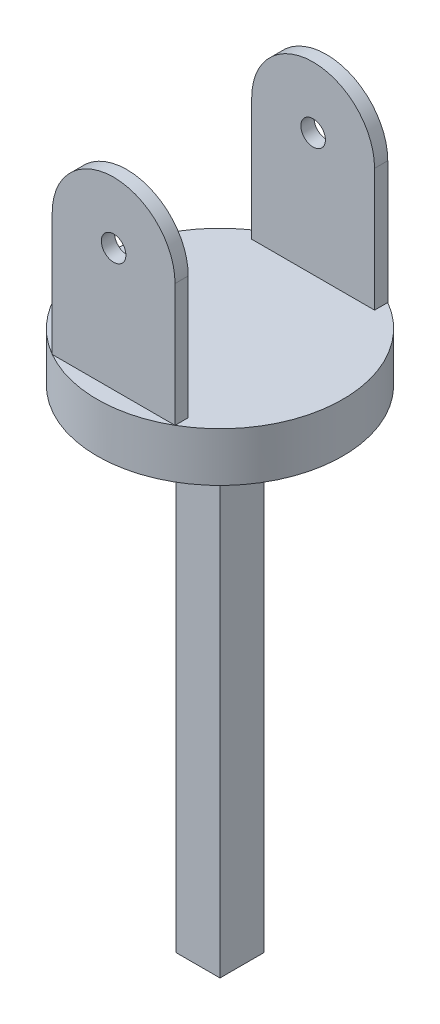
ISO-10303-21;
HEADER;
FILE_DESCRIPTION(('STEP AP214'),'2;1');
FILE_NAME('part.step','',(''),(''),'','','');
FILE_SCHEMA(('AUTOMOTIVE_DESIGN { 1 0 10303 214 1 1 1 1 }'));
ENDSEC;
DATA;
#1=APPLICATION_CONTEXT('core data for automotive mechanical design processes');
#2=APPLICATION_PROTOCOL_DEFINITION('international standard','automotive_design',2000,#1);
#3=PRODUCT_CONTEXT('',#1,'mechanical');
#4=PRODUCT('Part','Part','',(#3));
#5=PRODUCT_RELATED_PRODUCT_CATEGORY('part','',(#4));
#6=PRODUCT_DEFINITION_FORMATION('','',#4);
#7=PRODUCT_DEFINITION_CONTEXT('part definition',#1,'design');
#8=PRODUCT_DEFINITION('design','',#6,#7);
#9=PRODUCT_DEFINITION_SHAPE('','',#8);
#10=(LENGTH_UNIT() NAMED_UNIT(*) SI_UNIT(.MILLI.,.METRE.));
#11=(NAMED_UNIT(*) PLANE_ANGLE_UNIT() SI_UNIT($,.RADIAN.));
#12=(NAMED_UNIT(*) SI_UNIT($,.STERADIAN.) SOLID_ANGLE_UNIT());
#13=UNCERTAINTY_MEASURE_WITH_UNIT(LENGTH_MEASURE(1.E-05),#10,'distance_accuracy_value','');
#14=(GEOMETRIC_REPRESENTATION_CONTEXT(3) GLOBAL_UNCERTAINTY_ASSIGNED_CONTEXT((#13)) GLOBAL_UNIT_ASSIGNED_CONTEXT((#10,
#11,#12)) REPRESENTATION_CONTEXT('',''));
#15=CARTESIAN_POINT('',(0.,0.,0.));
#16=DIRECTION('',(0.,0.,1.));
#17=DIRECTION('',(1.,0.,0.));
#18=AXIS2_PLACEMENT_3D('',#15,#16,#17);
#19=CARTESIAN_POINT('',(0.,54.,-7.58489605585749));
#20=DIRECTION('',(0.,0.,1.));
#21=DIRECTION('',(1.,0.,0.));
#22=AXIS2_PLACEMENT_3D('',#19,#20,#21);
#23=CYLINDRICAL_SURFACE('',#22,5.);
#24=DIRECTION('',(0.,0.,-1.));
#25=VECTOR('',#24,1.);
#26=CARTESIAN_POINT('',(-5.,54.,-7.58489605585749));
#27=LINE('',#26,#25);
#28=CARTESIAN_POINT('',(-5.,54.,-7.58489605585749));
#29=VERTEX_POINT('',#28);
#30=CARTESIAN_POINT('',(-5.,54.,-8.66025403784439));
#31=VERTEX_POINT('',#30);
#32=EDGE_CURVE('E274',#29,#31,#27,.T.);
#33=ORIENTED_EDGE('',*,*,#32,.F.);
#34=CARTESIAN_POINT('',(0.,54.,-7.58489605585749));
#35=DIRECTION('',(0.,0.,-1.));
#36=DIRECTION('',(-1.,0.,0.));
#37=AXIS2_PLACEMENT_3D('',#34,#35,#36);
#38=CIRCLE('',#37,5.);
#39=CARTESIAN_POINT('',(5.,54.,-7.58489605585749));
#40=VERTEX_POINT('',#39);
#41=EDGE_CURVE('E56',#40,#29,#38,.F.);
#42=ORIENTED_EDGE('',*,*,#41,.F.);
#43=DIRECTION('',(0.,0.,-1.));
#44=VECTOR('',#43,1.);
#45=CARTESIAN_POINT('',(5.,54.,-7.58489605585749));
#46=LINE('',#45,#44);
#47=CARTESIAN_POINT('',(5.,54.,-8.66025403784439));
#48=VERTEX_POINT('',#47);
#49=EDGE_CURVE('E139',#48,#40,#46,.F.);
#50=ORIENTED_EDGE('',*,*,#49,.F.);
#51=CARTESIAN_POINT('',(0.,54.,-8.66025403784439));
#52=DIRECTION('',(0.,0.,1.));
#53=DIRECTION('',(1.,0.,0.));
#54=AXIS2_PLACEMENT_3D('',#51,#52,#53);
#55=CIRCLE('',#54,5.);
#56=EDGE_CURVE('E11',#31,#48,#55,.F.);
#57=ORIENTED_EDGE('',*,*,#56,.F.);
#58=EDGE_LOOP('',(#33,#42,#50,#57));
#59=FACE_BOUND('',#58,.T.);
#60=ADVANCED_FACE('F47',(#59),#23,.T.);
#61=CARTESIAN_POINT('',(0.,54.,8.66025403784439));
#62=DIRECTION('',(0.,0.,1.));
#63=DIRECTION('',(1.,0.,0.));
#64=AXIS2_PLACEMENT_3D('',#61,#62,#63);
#65=CYLINDRICAL_SURFACE('',#64,5.);
#66=DIRECTION('',(0.,0.,-1.));
#67=VECTOR('',#66,1.);
#68=CARTESIAN_POINT('',(-5.,54.,8.66025403784439));
#69=LINE('',#68,#67);
#70=CARTESIAN_POINT('',(-5.,54.,8.66025403784439));
#71=VERTEX_POINT('',#70);
#72=CARTESIAN_POINT('',(-5.,54.,7.58489605585749));
#73=VERTEX_POINT('',#72);
#74=EDGE_CURVE('E260',#71,#73,#69,.T.);
#75=ORIENTED_EDGE('',*,*,#74,.F.);
#76=CARTESIAN_POINT('',(0.,54.,8.66025403784439));
#77=DIRECTION('',(0.,0.,-1.));
#78=DIRECTION('',(-1.,0.,0.));
#79=AXIS2_PLACEMENT_3D('',#76,#77,#78);
#80=CIRCLE('',#79,5.);
#81=CARTESIAN_POINT('',(5.,54.,8.66025403784439));
#82=VERTEX_POINT('',#81);
#83=EDGE_CURVE('E268',#82,#71,#80,.F.);
#84=ORIENTED_EDGE('',*,*,#83,.F.);
#85=DIRECTION('',(0.,0.,-1.));
#86=VECTOR('',#85,1.);
#87=CARTESIAN_POINT('',(5.,54.,8.66025403784439));
#88=LINE('',#87,#86);
#89=CARTESIAN_POINT('',(5.,54.,7.58489605585749));
#90=VERTEX_POINT('',#89);
#91=EDGE_CURVE('E264',#90,#82,#88,.F.);
#92=ORIENTED_EDGE('',*,*,#91,.F.);
#93=CARTESIAN_POINT('',(0.,54.,7.58489605585749));
#94=DIRECTION('',(0.,0.,1.));
#95=DIRECTION('',(1.,0.,0.));
#96=AXIS2_PLACEMENT_3D('',#93,#94,#95);
#97=CIRCLE('',#96,5.);
#98=EDGE_CURVE('E271',#73,#90,#97,.F.);
#99=ORIENTED_EDGE('',*,*,#98,.F.);
#100=EDGE_LOOP('',(#75,#84,#92,#99));
#101=FACE_BOUND('',#100,.T.);
#102=ADVANCED_FACE('F314',(#101),#65,.T.);
#103=CARTESIAN_POINT('',(0.,44.,0.));
#104=DIRECTION('',(0.,1.,0.));
#105=DIRECTION('',(0.,0.,1.));
#106=AXIS2_PLACEMENT_3D('',#103,#104,#105);
#107=PLANE('',#106);
#108=DIRECTION('',(0.,0.,1.));
#109=VECTOR('',#108,1.);
#110=CARTESIAN_POINT('',(-5.,44.,-8.66025403784439));
#111=LINE('',#110,#109);
#112=CARTESIAN_POINT('',(-5.,44.,-8.66025403784439));
#113=VERTEX_POINT('',#112);
#114=CARTESIAN_POINT('',(-5.,44.,-7.58489605585749));
#115=VERTEX_POINT('',#114);
#116=EDGE_CURVE('E162',#113,#115,#111,.T.);
#117=ORIENTED_EDGE('',*,*,#116,.F.);
#118=CARTESIAN_POINT('',(0.,44.,0.));
#119=DIRECTION('',(0.,1.,0.));
#120=DIRECTION('',(0.,0.,1.));
#121=AXIS2_PLACEMENT_3D('',#118,#119,#120);
#122=CIRCLE('',#121,10.);
#123=CARTESIAN_POINT('',(-5.,44.,8.66025403784439));
#124=VERTEX_POINT('',#123);
#125=EDGE_CURVE('E285',#113,#124,#122,.T.);
#126=ORIENTED_EDGE('',*,*,#125,.T.);
#127=DIRECTION('',(0.,0.,1.));
#128=VECTOR('',#127,1.);
#129=CARTESIAN_POINT('',(-5.,44.,8.66025403784439));
#130=LINE('',#129,#128);
#131=CARTESIAN_POINT('',(-5.,44.,7.58489605585749));
#132=VERTEX_POINT('',#131);
#133=EDGE_CURVE('E193',#132,#124,#130,.T.);
#134=ORIENTED_EDGE('',*,*,#133,.F.);
#135=DIRECTION('',(-1.,0.,0.));
#136=VECTOR('',#135,1.);
#137=CARTESIAN_POINT('',(-5.,44.,7.58489605585749));
#138=LINE('',#137,#136);
#139=CARTESIAN_POINT('',(5.,44.,7.58489605585749));
#140=VERTEX_POINT('',#139);
#141=EDGE_CURVE('E197',#140,#132,#138,.T.);
#142=ORIENTED_EDGE('',*,*,#141,.F.);
#143=DIRECTION('',(0.,0.,-1.));
#144=VECTOR('',#143,1.);
#145=CARTESIAN_POINT('',(5.,44.,8.66025403784439));
#146=LINE('',#145,#144);
#147=CARTESIAN_POINT('',(5.,44.,8.66025403784439));
#148=VERTEX_POINT('',#147);
#149=EDGE_CURVE('E201',#148,#140,#146,.T.);
#150=ORIENTED_EDGE('',*,*,#149,.F.);
#151=CARTESIAN_POINT('',(5.,44.,-8.66025403784439));
#152=VERTEX_POINT('',#151);
#153=EDGE_CURVE('E155',#148,#152,#122,.T.);
#154=ORIENTED_EDGE('',*,*,#153,.T.);
#155=DIRECTION('',(0.,0.,-1.));
#156=VECTOR('',#155,1.);
#157=CARTESIAN_POINT('',(5.,44.,-8.66025403784439));
#158=LINE('',#157,#156);
#159=CARTESIAN_POINT('',(5.,44.,-7.58489605585749));
#160=VERTEX_POINT('',#159);
#161=EDGE_CURVE('E138',#160,#152,#158,.T.);
#162=ORIENTED_EDGE('',*,*,#161,.F.);
#163=DIRECTION('',(1.,0.,0.));
#164=VECTOR('',#163,1.);
#165=CARTESIAN_POINT('',(-5.,44.,-7.58489605585749));
#166=LINE('',#165,#164);
#167=EDGE_CURVE('E151',#115,#160,#166,.T.);
#168=ORIENTED_EDGE('',*,*,#167,.F.);
#169=EDGE_LOOP('',(#117,#126,#134,#142,#150,#154,#162,#168));
#170=FACE_BOUND('',#169,.T.);
#171=ADVANCED_FACE('F150',(#170),#107,.T.);
#172=DIRECTION('',(1.,0.,0.));
#173=VECTOR('',#172,1.);
#174=CARTESIAN_POINT('',(-5.,44.,8.66025403784439));
#175=LINE('',#174,#173);
#176=EDGE_CURVE('E165',#124,#148,#175,.T.);
#177=ORIENTED_EDGE('',*,*,#176,.F.);
#178=EDGE_CURVE('E212',#124,#148,#122,.T.);
#179=ORIENTED_EDGE('',*,*,#178,.T.);
#180=EDGE_LOOP('',(#177,#179));
#181=FACE_BOUND('',#180,.T.);
#182=ADVANCED_FACE('F326',(#181),#107,.T.);
#183=CARTESIAN_POINT('',(1.8,40.,1.8));
#184=DIRECTION('',(-1.,0.,0.));
#185=DIRECTION('',(0.,0.,1.));
#186=AXIS2_PLACEMENT_3D('',#183,#184,#185);
#187=PLANE('',#186);
#188=DIRECTION('',(0.,0.,-1.));
#189=VECTOR('',#188,1.);
#190=CARTESIAN_POINT('',(1.8,0.,1.8));
#191=LINE('',#190,#189);
#192=CARTESIAN_POINT('',(1.8,0.,1.8));
#193=VERTEX_POINT('',#192);
#194=CARTESIAN_POINT('',(1.8,0.,-1.8));
#195=VERTEX_POINT('',#194);
#196=EDGE_CURVE('E210',#193,#195,#191,.T.);
#197=ORIENTED_EDGE('',*,*,#196,.T.);
#198=DIRECTION('',(0.,-1.,0.));
#199=VECTOR('',#198,1.);
#200=CARTESIAN_POINT('',(1.8,40.,-1.8));
#201=LINE('',#200,#199);
#202=CARTESIAN_POINT('',(1.8,40.,-1.8));
#203=VERTEX_POINT('',#202);
#204=EDGE_CURVE('E256',#203,#195,#201,.T.);
#205=ORIENTED_EDGE('',*,*,#204,.F.);
#206=DIRECTION('',(0.,0.,-1.));
#207=VECTOR('',#206,1.);
#208=CARTESIAN_POINT('',(1.8,40.,1.8));
#209=LINE('',#208,#207);
#210=CARTESIAN_POINT('',(1.8,40.,1.8));
#211=VERTEX_POINT('',#210);
#212=EDGE_CURVE('E216',#211,#203,#209,.T.);
#213=ORIENTED_EDGE('',*,*,#212,.F.);
#214=DIRECTION('',(0.,-1.,0.));
#215=VECTOR('',#214,1.);
#216=CARTESIAN_POINT('',(1.8,40.,1.8));
#217=LINE('',#216,#215);
#218=EDGE_CURVE('E233',#211,#193,#217,.T.);
#219=ORIENTED_EDGE('',*,*,#218,.T.);
#220=EDGE_LOOP('',(#197,#205,#213,#219));
#221=FACE_BOUND('',#220,.T.);
#222=ADVANCED_FACE('F333',(#221),#187,.F.);
#223=CARTESIAN_POINT('',(-1.8,40.,-1.8));
#224=DIRECTION('',(0.,0.,1.));
#225=DIRECTION('',(1.,0.,0.));
#226=AXIS2_PLACEMENT_3D('',#223,#224,#225);
#227=PLANE('',#226);
#228=DIRECTION('',(-1.,0.,0.));
#229=VECTOR('',#228,1.);
#230=CARTESIAN_POINT('',(-1.8,0.,-1.8));
#231=LINE('',#230,#229);
#232=CARTESIAN_POINT('',(-1.8,0.,-1.8));
#233=VERTEX_POINT('',#232);
#234=EDGE_CURVE('E237',#195,#233,#231,.T.);
#235=ORIENTED_EDGE('',*,*,#234,.T.);
#236=DIRECTION('',(0.,-1.,0.));
#237=VECTOR('',#236,1.);
#238=CARTESIAN_POINT('',(-1.8,40.,-1.8));
#239=LINE('',#238,#237);
#240=CARTESIAN_POINT('',(-1.8,40.,-1.8));
#241=VERTEX_POINT('',#240);
#242=EDGE_CURVE('E252',#241,#233,#239,.T.);
#243=ORIENTED_EDGE('',*,*,#242,.F.);
#244=DIRECTION('',(-1.,0.,0.));
#245=VECTOR('',#244,1.);
#246=CARTESIAN_POINT('',(-1.8,40.,-1.8));
#247=LINE('',#246,#245);
#248=EDGE_CURVE('E220',#203,#241,#247,.T.);
#249=ORIENTED_EDGE('',*,*,#248,.F.);
#250=ORIENTED_EDGE('',*,*,#204,.T.);
#251=EDGE_LOOP('',(#235,#243,#249,#250));
#252=FACE_BOUND('',#251,.T.);
#253=ADVANCED_FACE('F336',(#252),#227,.F.);
#254=CARTESIAN_POINT('',(-1.8,40.,1.8));
#255=DIRECTION('',(1.,0.,0.));
#256=DIRECTION('',(0.,0.,-1.));
#257=AXIS2_PLACEMENT_3D('',#254,#255,#256);
#258=PLANE('',#257);
#259=DIRECTION('',(0.,0.,1.));
#260=VECTOR('',#259,1.);
#261=CARTESIAN_POINT('',(-1.8,0.,1.8));
#262=LINE('',#261,#260);
#263=CARTESIAN_POINT('',(-1.8,0.,1.8));
#264=VERTEX_POINT('',#263);
#265=EDGE_CURVE('E240',#233,#264,#262,.T.);
#266=ORIENTED_EDGE('',*,*,#265,.T.);
#267=DIRECTION('',(0.,-1.,0.));
#268=VECTOR('',#267,1.);
#269=CARTESIAN_POINT('',(-1.8,40.,1.8));
#270=LINE('',#269,#268);
#271=CARTESIAN_POINT('',(-1.8,40.,1.8));
#272=VERTEX_POINT('',#271);
#273=EDGE_CURVE('E248',#272,#264,#270,.T.);
#274=ORIENTED_EDGE('',*,*,#273,.F.);
#275=DIRECTION('',(0.,0.,1.));
#276=VECTOR('',#275,1.);
#277=CARTESIAN_POINT('',(-1.8,40.,1.8));
#278=LINE('',#277,#276);
#279=EDGE_CURVE('E225',#241,#272,#278,.T.);
#280=ORIENTED_EDGE('',*,*,#279,.F.);
#281=ORIENTED_EDGE('',*,*,#242,.T.);
#282=EDGE_LOOP('',(#266,#274,#280,#281));
#283=FACE_BOUND('',#282,.T.);
#284=ADVANCED_FACE('F340',(#283),#258,.F.);
#285=CARTESIAN_POINT('',(-1.8,40.,1.8));
#286=DIRECTION('',(0.,0.,-1.));
#287=DIRECTION('',(-1.,0.,0.));
#288=AXIS2_PLACEMENT_3D('',#285,#286,#287);
#289=PLANE('',#288);
#290=DIRECTION('',(1.,0.,0.));
#291=VECTOR('',#290,1.);
#292=CARTESIAN_POINT('',(-1.8,0.,1.8));
#293=LINE('',#292,#291);
#294=EDGE_CURVE('E221',#264,#193,#293,.T.);
#295=ORIENTED_EDGE('',*,*,#294,.T.);
#296=ORIENTED_EDGE('',*,*,#218,.F.);
#297=DIRECTION('',(1.,0.,0.));
#298=VECTOR('',#297,1.);
#299=CARTESIAN_POINT('',(-1.8,40.,1.8));
#300=LINE('',#299,#298);
#301=EDGE_CURVE('E229',#272,#211,#300,.T.);
#302=ORIENTED_EDGE('',*,*,#301,.F.);
#303=ORIENTED_EDGE('',*,*,#273,.T.);
#304=EDGE_LOOP('',(#295,#296,#302,#303));
#305=FACE_BOUND('',#304,.T.);
#306=ADVANCED_FACE('F344',(#305),#289,.F.);
#307=CARTESIAN_POINT('',(0.,0.,0.));
#308=DIRECTION('',(0.,-1.,0.));
#309=DIRECTION('',(0.,0.,-1.));
#310=AXIS2_PLACEMENT_3D('',#307,#308,#309);
#311=PLANE('',#310);
#312=ORIENTED_EDGE('',*,*,#196,.F.);
#313=ORIENTED_EDGE('',*,*,#294,.F.);
#314=ORIENTED_EDGE('',*,*,#265,.F.);
#315=ORIENTED_EDGE('',*,*,#234,.F.);
#316=EDGE_LOOP('',(#312,#313,#314,#315));
#317=FACE_BOUND('',#316,.T.);
#318=ADVANCED_FACE('F348',(#317),#311,.T.);
#319=CARTESIAN_POINT('',(0.,40.,0.));
#320=DIRECTION('',(0.,1.,0.));
#321=DIRECTION('',(0.,0.,1.));
#322=AXIS2_PLACEMENT_3D('',#319,#320,#321);
#323=PLANE('',#322);
#324=CARTESIAN_POINT('',(0.,40.,0.));
#325=DIRECTION('',(0.,1.,0.));
#326=DIRECTION('',(0.,0.,1.));
#327=AXIS2_PLACEMENT_3D('',#324,#325,#326);
#328=CIRCLE('',#327,10.);
#329=CARTESIAN_POINT('',(0.,40.,10.));
#330=VERTEX_POINT('',#329);
#331=EDGE_CURVE('E179',#330,#330,#328,.T.);
#332=ORIENTED_EDGE('',*,*,#331,.F.);
#333=EDGE_LOOP('',(#332));
#334=FACE_BOUND('',#333,.T.);
#335=ORIENTED_EDGE('',*,*,#301,.T.);
#336=ORIENTED_EDGE('',*,*,#212,.T.);
#337=ORIENTED_EDGE('',*,*,#248,.T.);
#338=ORIENTED_EDGE('',*,*,#279,.T.);
#339=EDGE_LOOP('',(#335,#336,#337,#338));
#340=FACE_BOUND('',#339,.T.);
#341=ADVANCED_FACE('F352',(#334,#340),#323,.F.);
#342=CARTESIAN_POINT('',(0.,44.,0.));
#343=DIRECTION('',(0.,-1.,0.));
#344=DIRECTION('',(0.,0.,-1.));
#345=AXIS2_PLACEMENT_3D('',#342,#343,#344);
#346=CYLINDRICAL_SURFACE('',#345,10.);
#347=ORIENTED_EDGE('',*,*,#153,.F.);
#348=ORIENTED_EDGE('',*,*,#178,.F.);
#349=ORIENTED_EDGE('',*,*,#125,.F.);
#350=EDGE_CURVE('E211',#152,#113,#122,.T.);
#351=ORIENTED_EDGE('',*,*,#350,.F.);
#352=EDGE_LOOP('',(#347,#348,#349,#351));
#353=FACE_BOUND('',#352,.T.);
#354=ORIENTED_EDGE('',*,*,#331,.T.);
#355=EDGE_LOOP('',(#354));
#356=FACE_BOUND('',#355,.T.);
#357=ADVANCED_FACE('F290',(#353,#356),#346,.T.);
#358=DIRECTION('',(-1.,0.,0.));
#359=VECTOR('',#358,1.);
#360=CARTESIAN_POINT('',(-5.,44.,-8.66025403784439));
#361=LINE('',#360,#359);
#362=EDGE_CURVE('E157',#152,#113,#361,.T.);
#363=ORIENTED_EDGE('',*,*,#362,.F.);
#364=ORIENTED_EDGE('',*,*,#350,.T.);
#365=EDGE_LOOP('',(#363,#364));
#366=FACE_BOUND('',#365,.T.);
#367=ADVANCED_FACE('F296',(#366),#107,.T.);
#368=CARTESIAN_POINT('',(-5.,59.,8.66025403784439));
#369=DIRECTION('',(0.,0.,-1.));
#370=DIRECTION('',(-1.,0.,0.));
#371=AXIS2_PLACEMENT_3D('',#368,#369,#370);
#372=PLANE('',#371);
#373=CARTESIAN_POINT('',(0.,54.,8.66025403784439));
#374=DIRECTION('',(0.,0.,1.));
#375=DIRECTION('',(1.,0.,0.));
#376=AXIS2_PLACEMENT_3D('',#373,#374,#375);
#377=CIRCLE('',#376,1.);
#378=CARTESIAN_POINT('',(1.,54.,8.66025403784439));
#379=VERTEX_POINT('',#378);
#380=EDGE_CURVE('E388',#379,#379,#377,.T.);
#381=ORIENTED_EDGE('',*,*,#380,.F.);
#382=EDGE_LOOP('',(#381));
#383=FACE_BOUND('',#382,.T.);
#384=DIRECTION('',(0.,-1.,0.));
#385=VECTOR('',#384,1.);
#386=CARTESIAN_POINT('',(5.,59.,8.66025403784439));
#387=LINE('',#386,#385);
#388=EDGE_CURVE('E180',#82,#148,#387,.T.);
#389=ORIENTED_EDGE('',*,*,#388,.F.);
#390=ORIENTED_EDGE('',*,*,#83,.T.);
#391=DIRECTION('',(0.,-1.,0.));
#392=VECTOR('',#391,1.);
#393=CARTESIAN_POINT('',(-5.,59.,8.66025403784439));
#394=LINE('',#393,#392);
#395=EDGE_CURVE('E190',#71,#124,#394,.T.);
#396=ORIENTED_EDGE('',*,*,#395,.T.);
#397=ORIENTED_EDGE('',*,*,#176,.T.);
#398=EDGE_LOOP('',(#389,#390,#396,#397));
#399=FACE_BOUND('',#398,.T.);
#400=ADVANCED_FACE('F359',(#383,#399),#372,.F.);
#401=CARTESIAN_POINT('',(5.,59.,8.66025403784439));
#402=DIRECTION('',(-1.,0.,0.));
#403=DIRECTION('',(0.,0.,1.));
#404=AXIS2_PLACEMENT_3D('',#401,#402,#403);
#405=PLANE('',#404);
#406=DIRECTION('',(0.,-1.,0.));
#407=VECTOR('',#406,1.);
#408=CARTESIAN_POINT('',(5.,59.,7.58489605585749));
#409=LINE('',#408,#407);
#410=EDGE_CURVE('E183',#90,#140,#409,.T.);
#411=ORIENTED_EDGE('',*,*,#410,.F.);
#412=ORIENTED_EDGE('',*,*,#91,.T.);
#413=ORIENTED_EDGE('',*,*,#388,.T.);
#414=ORIENTED_EDGE('',*,*,#149,.T.);
#415=EDGE_LOOP('',(#411,#412,#413,#414));
#416=FACE_BOUND('',#415,.T.);
#417=ADVANCED_FACE('F366',(#416),#405,.F.);
#418=CARTESIAN_POINT('',(-5.,59.,7.58489605585749));
#419=DIRECTION('',(0.,0.,1.));
#420=DIRECTION('',(1.,0.,0.));
#421=AXIS2_PLACEMENT_3D('',#418,#419,#420);
#422=PLANE('',#421);
#423=CARTESIAN_POINT('',(0.,54.,7.58489605585749));
#424=DIRECTION('',(0.,0.,1.));
#425=DIRECTION('',(1.,0.,0.));
#426=AXIS2_PLACEMENT_3D('',#423,#424,#425);
#427=CIRCLE('',#426,1.);
#428=CARTESIAN_POINT('',(1.,54.,7.58489605585749));
#429=VERTEX_POINT('',#428);
#430=EDGE_CURVE('E184',#429,#429,#427,.T.);
#431=ORIENTED_EDGE('',*,*,#430,.T.);
#432=EDGE_LOOP('',(#431));
#433=FACE_BOUND('',#432,.T.);
#434=DIRECTION('',(0.,-1.,0.));
#435=VECTOR('',#434,1.);
#436=CARTESIAN_POINT('',(-5.,59.,7.58489605585749));
#437=LINE('',#436,#435);
#438=EDGE_CURVE('E187',#73,#132,#437,.T.);
#439=ORIENTED_EDGE('',*,*,#438,.F.);
#440=ORIENTED_EDGE('',*,*,#98,.T.);
#441=ORIENTED_EDGE('',*,*,#410,.T.);
#442=ORIENTED_EDGE('',*,*,#141,.T.);
#443=EDGE_LOOP('',(#439,#440,#441,#442));
#444=FACE_BOUND('',#443,.T.);
#445=ADVANCED_FACE('F362',(#433,#444),#422,.F.);
#446=CARTESIAN_POINT('',(-5.,59.,8.66025403784439));
#447=DIRECTION('',(1.,0.,0.));
#448=DIRECTION('',(0.,0.,-1.));
#449=AXIS2_PLACEMENT_3D('',#446,#447,#448);
#450=PLANE('',#449);
#451=ORIENTED_EDGE('',*,*,#395,.F.);
#452=ORIENTED_EDGE('',*,*,#74,.T.);
#453=ORIENTED_EDGE('',*,*,#438,.T.);
#454=ORIENTED_EDGE('',*,*,#133,.T.);
#455=EDGE_LOOP('',(#451,#452,#453,#454));
#456=FACE_BOUND('',#455,.T.);
#457=ADVANCED_FACE('F360',(#456),#450,.F.);
#458=CARTESIAN_POINT('',(-5.,59.,-8.66025403784439));
#459=DIRECTION('',(1.,0.,0.));
#460=DIRECTION('',(0.,0.,-1.));
#461=AXIS2_PLACEMENT_3D('',#458,#459,#460);
#462=PLANE('',#461);
#463=DIRECTION('',(0.,-1.,0.));
#464=VECTOR('',#463,1.);
#465=CARTESIAN_POINT('',(-5.,59.,-7.58489605585749));
#466=LINE('',#465,#464);
#467=EDGE_CURVE('E143',#29,#115,#466,.T.);
#468=ORIENTED_EDGE('',*,*,#467,.F.);
#469=ORIENTED_EDGE('',*,*,#32,.T.);
#470=DIRECTION('',(0.,-1.,0.));
#471=VECTOR('',#470,1.);
#472=CARTESIAN_POINT('',(-5.,59.,-8.66025403784439));
#473=LINE('',#472,#471);
#474=EDGE_CURVE('E172',#31,#113,#473,.T.);
#475=ORIENTED_EDGE('',*,*,#474,.T.);
#476=ORIENTED_EDGE('',*,*,#116,.T.);
#477=EDGE_LOOP('',(#468,#469,#475,#476));
#478=FACE_BOUND('',#477,.T.);
#479=ADVANCED_FACE('F281',(#478),#462,.F.);
#480=CARTESIAN_POINT('',(-5.,59.,-7.58489605585749));
#481=DIRECTION('',(0.,0.,-1.));
#482=DIRECTION('',(-1.,0.,0.));
#483=AXIS2_PLACEMENT_3D('',#480,#481,#482);
#484=PLANE('',#483);
#485=CARTESIAN_POINT('',(0.,54.,-7.58489605585749));
#486=DIRECTION('',(0.,0.,-1.));
#487=DIRECTION('',(-1.,0.,0.));
#488=AXIS2_PLACEMENT_3D('',#485,#486,#487);
#489=CIRCLE('',#488,1.);
#490=CARTESIAN_POINT('',(-1.,54.,-7.58489605585749));
#491=VERTEX_POINT('',#490);
#492=EDGE_CURVE('E379',#491,#491,#489,.T.);
#493=ORIENTED_EDGE('',*,*,#492,.T.);
#494=EDGE_LOOP('',(#493));
#495=FACE_BOUND('',#494,.T.);
#496=DIRECTION('',(0.,-1.,0.));
#497=VECTOR('',#496,1.);
#498=CARTESIAN_POINT('',(5.,59.,-7.58489605585749));
#499=LINE('',#498,#497);
#500=EDGE_CURVE('E134',#40,#160,#499,.T.);
#501=ORIENTED_EDGE('',*,*,#500,.F.);
#502=ORIENTED_EDGE('',*,*,#41,.T.);
#503=ORIENTED_EDGE('',*,*,#467,.T.);
#504=ORIENTED_EDGE('',*,*,#167,.T.);
#505=EDGE_LOOP('',(#501,#502,#503,#504));
#506=FACE_BOUND('',#505,.T.);
#507=ADVANCED_FACE('F159',(#495,#506),#484,.F.);
#508=CARTESIAN_POINT('',(5.,59.,-8.66025403784439));
#509=DIRECTION('',(-1.,0.,0.));
#510=DIRECTION('',(0.,0.,1.));
#511=AXIS2_PLACEMENT_3D('',#508,#509,#510);
#512=PLANE('',#511);
#513=DIRECTION('',(0.,-1.,0.));
#514=VECTOR('',#513,1.);
#515=CARTESIAN_POINT('',(5.,59.,-8.66025403784439));
#516=LINE('',#515,#514);
#517=EDGE_CURVE('E144',#48,#152,#516,.T.);
#518=ORIENTED_EDGE('',*,*,#517,.F.);
#519=ORIENTED_EDGE('',*,*,#49,.T.);
#520=ORIENTED_EDGE('',*,*,#500,.T.);
#521=ORIENTED_EDGE('',*,*,#161,.T.);
#522=EDGE_LOOP('',(#518,#519,#520,#521));
#523=FACE_BOUND('',#522,.T.);
#524=ADVANCED_FACE('F137',(#523),#512,.F.);
#525=CARTESIAN_POINT('',(-5.,59.,-8.66025403784439));
#526=DIRECTION('',(0.,0.,1.));
#527=DIRECTION('',(1.,0.,0.));
#528=AXIS2_PLACEMENT_3D('',#525,#526,#527);
#529=PLANE('',#528);
#530=CARTESIAN_POINT('',(0.,54.,-8.66025403784439));
#531=DIRECTION('',(0.,0.,1.));
#532=DIRECTION('',(1.,0.,0.));
#533=AXIS2_PLACEMENT_3D('',#530,#531,#532);
#534=CIRCLE('',#533,1.);
#535=CARTESIAN_POINT('',(1.,54.,-8.66025403784439));
#536=VERTEX_POINT('',#535);
#537=EDGE_CURVE('E382',#536,#536,#534,.F.);
#538=ORIENTED_EDGE('',*,*,#537,.F.);
#539=EDGE_LOOP('',(#538));
#540=FACE_BOUND('',#539,.T.);
#541=ORIENTED_EDGE('',*,*,#474,.F.);
#542=ORIENTED_EDGE('',*,*,#56,.T.);
#543=ORIENTED_EDGE('',*,*,#517,.T.);
#544=ORIENTED_EDGE('',*,*,#362,.T.);
#545=EDGE_LOOP('',(#541,#542,#543,#544));
#546=FACE_BOUND('',#545,.T.);
#547=ADVANCED_FACE('F298',(#540,#546),#529,.F.);
#548=CARTESIAN_POINT('',(0.,54.,-11.4886811625906));
#549=DIRECTION('',(0.,0.,1.));
#550=DIRECTION('',(1.,0.,0.));
#551=AXIS2_PLACEMENT_3D('',#548,#549,#550);
#552=CYLINDRICAL_SURFACE('',#551,1.);
#553=ORIENTED_EDGE('',*,*,#537,.T.);
#554=EDGE_LOOP('',(#553));
#555=FACE_BOUND('',#554,.T.);
#556=ORIENTED_EDGE('',*,*,#492,.F.);
#557=EDGE_LOOP('',(#556));
#558=FACE_BOUND('',#557,.T.);
#559=ADVANCED_FACE('F300',(#555,#558),#552,.F.);
#560=ORIENTED_EDGE('',*,*,#380,.T.);
#561=EDGE_LOOP('',(#560));
#562=FACE_BOUND('',#561,.T.);
#563=ORIENTED_EDGE('',*,*,#430,.F.);
#564=EDGE_LOOP('',(#563));
#565=FACE_BOUND('',#564,.T.);
#566=ADVANCED_FACE('F307',(#562,#565),#552,.F.);
#567=CLOSED_SHELL('',(#60,#102,#171,#182,#222,#253,#284,#306,#318,#341,#357,#367,#400,#417,#445,
#457,#479,#507,#524,#547,#559,#566));
#568=MANIFOLD_SOLID_BREP('B2',#567);
#569=ADVANCED_BREP_SHAPE_REPRESENTATION('',(#18,#568),#14);
#570=SHAPE_DEFINITION_REPRESENTATION(#9,#569);
ENDSEC;
END-ISO-10303-21;
